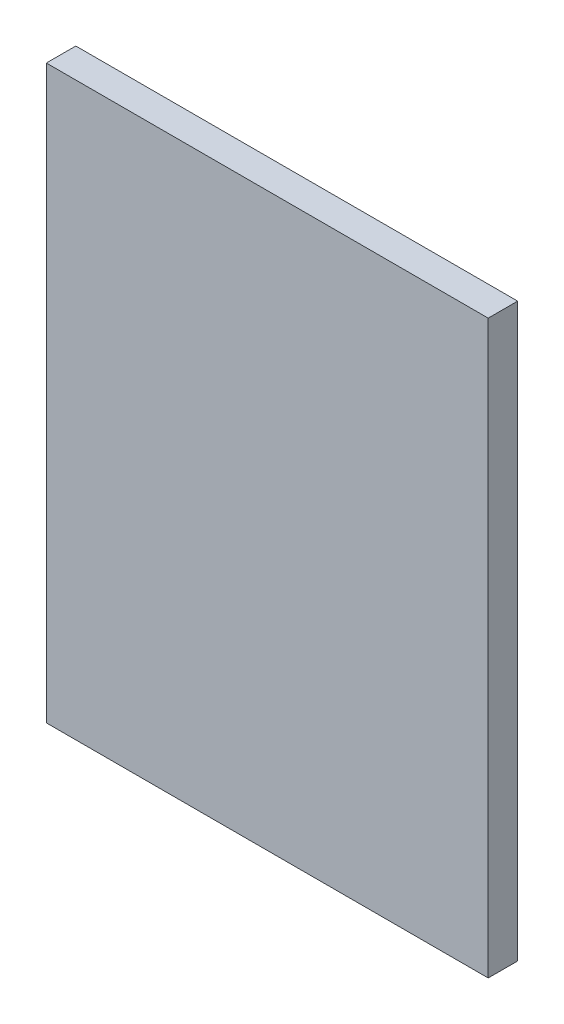
ISO-10303-21;
HEADER;
FILE_DESCRIPTION(('STEP AP214'),'2;1');
FILE_NAME('part.step','',(''),(''),'','','');
FILE_SCHEMA(('AUTOMOTIVE_DESIGN { 1 0 10303 214 1 1 1 1 }'));
ENDSEC;
DATA;
#1=APPLICATION_CONTEXT('core data for automotive mechanical design processes');
#2=APPLICATION_PROTOCOL_DEFINITION('international standard','automotive_design',2000,#1);
#3=PRODUCT_CONTEXT('',#1,'mechanical');
#4=PRODUCT('Part','Part','',(#3));
#5=PRODUCT_RELATED_PRODUCT_CATEGORY('part','',(#4));
#6=PRODUCT_DEFINITION_FORMATION('','',#4);
#7=PRODUCT_DEFINITION_CONTEXT('part definition',#1,'design');
#8=PRODUCT_DEFINITION('design','',#6,#7);
#9=PRODUCT_DEFINITION_SHAPE('','',#8);
#10=(LENGTH_UNIT() NAMED_UNIT(*) SI_UNIT(.MILLI.,.METRE.));
#11=(NAMED_UNIT(*) PLANE_ANGLE_UNIT() SI_UNIT($,.RADIAN.));
#12=(NAMED_UNIT(*) SI_UNIT($,.STERADIAN.) SOLID_ANGLE_UNIT());
#13=UNCERTAINTY_MEASURE_WITH_UNIT(LENGTH_MEASURE(1.E-05),#10,'distance_accuracy_value','');
#14=(GEOMETRIC_REPRESENTATION_CONTEXT(3) GLOBAL_UNCERTAINTY_ASSIGNED_CONTEXT((#13)) GLOBAL_UNIT_ASSIGNED_CONTEXT((#10,
#11,#12)) REPRESENTATION_CONTEXT('',''));
#15=CARTESIAN_POINT('',(0.,0.,0.));
#16=DIRECTION('',(0.,0.,1.));
#17=DIRECTION('',(1.,0.,0.));
#18=AXIS2_PLACEMENT_3D('',#15,#16,#17);
#19=CARTESIAN_POINT('',(-75.6361607142857,48.0133928571429,5.));
#20=DIRECTION('',(1.,0.,0.));
#21=DIRECTION('',(0.,1.,0.));
#22=AXIS2_PLACEMENT_3D('',#19,#20,#21);
#23=PLANE('',#22);
#24=DIRECTION('',(0.,-1.,0.));
#25=VECTOR('',#24,1.);
#26=CARTESIAN_POINT('',(-75.6361607142857,48.0133928571429,0.));
#27=LINE('',#26,#25);
#28=CARTESIAN_POINT('',(-75.6361607142857,48.0133928571429,0.));
#29=VERTEX_POINT('',#28);
#30=CARTESIAN_POINT('',(-75.6361607142857,-48.9866071428571,0.));
#31=VERTEX_POINT('',#30);
#32=EDGE_CURVE('E107',#29,#31,#27,.T.);
#33=ORIENTED_EDGE('',*,*,#32,.T.);
#34=DIRECTION('',(0.,0.,-1.));
#35=VECTOR('',#34,1.);
#36=CARTESIAN_POINT('',(-75.6361607142857,-48.9866071428571,5.));
#37=LINE('',#36,#35);
#38=CARTESIAN_POINT('',(-75.6361607142857,-48.9866071428571,5.));
#39=VERTEX_POINT('',#38);
#40=EDGE_CURVE('E11',#39,#31,#37,.T.);
#41=ORIENTED_EDGE('',*,*,#40,.F.);
#42=DIRECTION('',(0.,-1.,0.));
#43=VECTOR('',#42,1.);
#44=CARTESIAN_POINT('',(-75.6361607142857,48.0133928571429,5.));
#45=LINE('',#44,#43);
#46=CARTESIAN_POINT('',(-75.6361607142857,48.0133928571429,5.));
#47=VERTEX_POINT('',#46);
#48=EDGE_CURVE('E91',#47,#39,#45,.T.);
#49=ORIENTED_EDGE('',*,*,#48,.F.);
#50=DIRECTION('',(0.,0.,-1.));
#51=VECTOR('',#50,1.);
#52=CARTESIAN_POINT('',(-75.6361607142857,48.0133928571429,5.));
#53=LINE('',#52,#51);
#54=EDGE_CURVE('E103',#47,#29,#53,.T.);
#55=ORIENTED_EDGE('',*,*,#54,.T.);
#56=EDGE_LOOP('',(#33,#41,#49,#55));
#57=FACE_BOUND('',#56,.T.);
#58=ADVANCED_FACE('F39',(#57),#23,.F.);
#59=CARTESIAN_POINT('',(-75.6361607142857,-48.9866071428571,5.));
#60=DIRECTION('',(0.,1.,0.));
#61=DIRECTION('',(0.,0.,1.));
#62=AXIS2_PLACEMENT_3D('',#59,#60,#61);
#63=PLANE('',#62);
#64=DIRECTION('',(1.,0.,0.));
#65=VECTOR('',#64,1.);
#66=CARTESIAN_POINT('',(-75.6361607142857,-48.9866071428571,0.));
#67=LINE('',#66,#65);
#68=CARTESIAN_POINT('',(-0.636160714285711,-48.9866071428571,0.));
#69=VERTEX_POINT('',#68);
#70=EDGE_CURVE('E96',#31,#69,#67,.T.);
#71=ORIENTED_EDGE('',*,*,#70,.T.);
#72=DIRECTION('',(0.,0.,-1.));
#73=VECTOR('',#72,1.);
#74=CARTESIAN_POINT('',(-0.636160714285711,-48.9866071428571,5.));
#75=LINE('',#74,#73);
#76=CARTESIAN_POINT('',(-0.636160714285711,-48.9866071428571,5.));
#77=VERTEX_POINT('',#76);
#78=EDGE_CURVE('E48',#77,#69,#75,.T.);
#79=ORIENTED_EDGE('',*,*,#78,.F.);
#80=DIRECTION('',(1.,0.,0.));
#81=VECTOR('',#80,1.);
#82=CARTESIAN_POINT('',(-75.6361607142857,-48.9866071428571,5.));
#83=LINE('',#82,#81);
#84=EDGE_CURVE('E86',#39,#77,#83,.T.);
#85=ORIENTED_EDGE('',*,*,#84,.F.);
#86=ORIENTED_EDGE('',*,*,#40,.T.);
#87=EDGE_LOOP('',(#71,#79,#85,#86));
#88=FACE_BOUND('',#87,.T.);
#89=ADVANCED_FACE('F95',(#88),#63,.F.);
#90=CARTESIAN_POINT('',(-0.636160714285725,48.0133928571429,5.));
#91=DIRECTION('',(-1.,0.,0.));
#92=DIRECTION('',(0.,-1.,0.));
#93=AXIS2_PLACEMENT_3D('',#90,#91,#92);
#94=PLANE('',#93);
#95=DIRECTION('',(0.,1.,0.));
#96=VECTOR('',#95,1.);
#97=CARTESIAN_POINT('',(-0.636160714285725,48.0133928571429,0.));
#98=LINE('',#97,#96);
#99=CARTESIAN_POINT('',(-0.636160714285725,48.0133928571429,0.));
#100=VERTEX_POINT('',#99);
#101=EDGE_CURVE('E73',#69,#100,#98,.T.);
#102=ORIENTED_EDGE('',*,*,#101,.T.);
#103=DIRECTION('',(0.,0.,-1.));
#104=VECTOR('',#103,1.);
#105=CARTESIAN_POINT('',(-0.636160714285725,48.0133928571429,5.));
#106=LINE('',#105,#104);
#107=CARTESIAN_POINT('',(-0.636160714285725,48.0133928571429,5.));
#108=VERTEX_POINT('',#107);
#109=EDGE_CURVE('E98',#108,#100,#106,.T.);
#110=ORIENTED_EDGE('',*,*,#109,.F.);
#111=DIRECTION('',(0.,1.,0.));
#112=VECTOR('',#111,1.);
#113=CARTESIAN_POINT('',(-0.636160714285725,48.0133928571429,5.));
#114=LINE('',#113,#112);
#115=EDGE_CURVE('E89',#77,#108,#114,.T.);
#116=ORIENTED_EDGE('',*,*,#115,.F.);
#117=ORIENTED_EDGE('',*,*,#78,.T.);
#118=EDGE_LOOP('',(#102,#110,#116,#117));
#119=FACE_BOUND('',#118,.T.);
#120=ADVANCED_FACE('F99',(#119),#94,.F.);
#121=CARTESIAN_POINT('',(-75.6361607142857,48.0133928571429,5.));
#122=DIRECTION('',(0.,-1.,0.));
#123=DIRECTION('',(0.,0.,-1.));
#124=AXIS2_PLACEMENT_3D('',#121,#122,#123);
#125=PLANE('',#124);
#126=DIRECTION('',(-1.,0.,0.));
#127=VECTOR('',#126,1.);
#128=CARTESIAN_POINT('',(-75.6361607142857,48.0133928571429,0.));
#129=LINE('',#128,#127);
#130=EDGE_CURVE('E79',#100,#29,#129,.T.);
#131=ORIENTED_EDGE('',*,*,#130,.T.);
#132=ORIENTED_EDGE('',*,*,#54,.F.);
#133=DIRECTION('',(-1.,0.,0.));
#134=VECTOR('',#133,1.);
#135=CARTESIAN_POINT('',(-75.6361607142857,48.0133928571429,5.));
#136=LINE('',#135,#134);
#137=EDGE_CURVE('E56',#108,#47,#136,.T.);
#138=ORIENTED_EDGE('',*,*,#137,.F.);
#139=ORIENTED_EDGE('',*,*,#109,.T.);
#140=EDGE_LOOP('',(#131,#132,#138,#139));
#141=FACE_BOUND('',#140,.T.);
#142=ADVANCED_FACE('F120',(#141),#125,.F.);
#143=CARTESIAN_POINT('',(0.,0.,5.));
#144=DIRECTION('',(0.,0.,1.));
#145=DIRECTION('',(1.,0.,0.));
#146=AXIS2_PLACEMENT_3D('',#143,#144,#145);
#147=PLANE('',#146);
#148=ORIENTED_EDGE('',*,*,#48,.T.);
#149=ORIENTED_EDGE('',*,*,#84,.T.);
#150=ORIENTED_EDGE('',*,*,#115,.T.);
#151=ORIENTED_EDGE('',*,*,#137,.T.);
#152=EDGE_LOOP('',(#148,#149,#150,#151));
#153=FACE_BOUND('',#152,.T.);
#154=ADVANCED_FACE('F87',(#153),#147,.T.);
#155=CARTESIAN_POINT('',(0.,0.,0.));
#156=DIRECTION('',(0.,0.,1.));
#157=DIRECTION('',(1.,0.,0.));
#158=AXIS2_PLACEMENT_3D('',#155,#156,#157);
#159=PLANE('',#158);
#160=ORIENTED_EDGE('',*,*,#32,.F.);
#161=ORIENTED_EDGE('',*,*,#130,.F.);
#162=ORIENTED_EDGE('',*,*,#101,.F.);
#163=ORIENTED_EDGE('',*,*,#70,.F.);
#164=EDGE_LOOP('',(#160,#161,#162,#163));
#165=FACE_BOUND('',#164,.T.);
#166=ADVANCED_FACE('F123',(#165),#159,.F.);
#167=CLOSED_SHELL('',(#58,#89,#120,#142,#154,#166));
#168=MANIFOLD_SOLID_BREP('B2',#167);
#169=ADVANCED_BREP_SHAPE_REPRESENTATION('',(#18,#168),#14);
#170=SHAPE_DEFINITION_REPRESENTATION(#9,#169);
ENDSEC;
END-ISO-10303-21;
